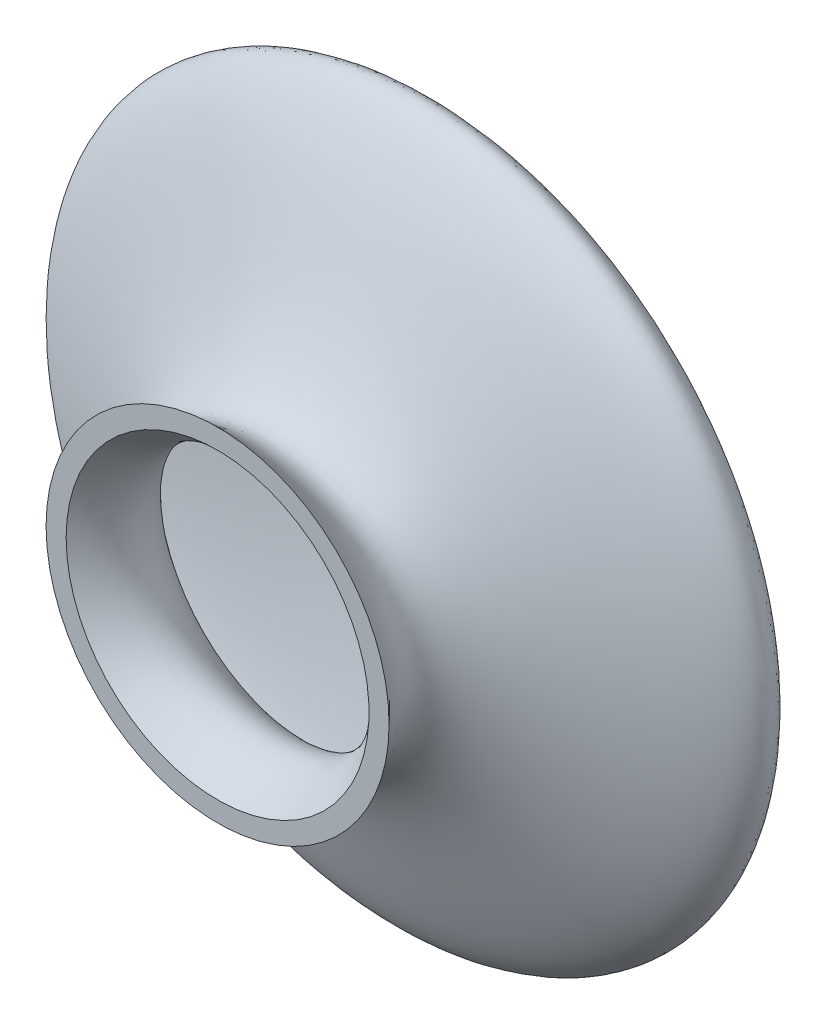
ISO-10303-21;
HEADER;
FILE_DESCRIPTION(('STEP AP214'),'2;1');
FILE_NAME('part.step','',(''),(''),'','','');
FILE_SCHEMA(('AUTOMOTIVE_DESIGN { 1 0 10303 214 1 1 1 1 }'));
ENDSEC;
DATA;
#1=APPLICATION_CONTEXT('core data for automotive mechanical design processes');
#2=APPLICATION_PROTOCOL_DEFINITION('international standard','automotive_design',2000,#1);
#3=PRODUCT_CONTEXT('',#1,'mechanical');
#4=PRODUCT('Part','Part','',(#3));
#5=PRODUCT_RELATED_PRODUCT_CATEGORY('part','',(#4));
#6=PRODUCT_DEFINITION_FORMATION('','',#4);
#7=PRODUCT_DEFINITION_CONTEXT('part definition',#1,'design');
#8=PRODUCT_DEFINITION('design','',#6,#7);
#9=PRODUCT_DEFINITION_SHAPE('','',#8);
#10=(LENGTH_UNIT() NAMED_UNIT(*) SI_UNIT(.MILLI.,.METRE.));
#11=(NAMED_UNIT(*) PLANE_ANGLE_UNIT() SI_UNIT($,.RADIAN.));
#12=(NAMED_UNIT(*) SI_UNIT($,.STERADIAN.) SOLID_ANGLE_UNIT());
#13=UNCERTAINTY_MEASURE_WITH_UNIT(LENGTH_MEASURE(1.E-05),#10,'distance_accuracy_value','');
#14=(GEOMETRIC_REPRESENTATION_CONTEXT(3) GLOBAL_UNCERTAINTY_ASSIGNED_CONTEXT((#13)) GLOBAL_UNIT_ASSIGNED_CONTEXT((#10,
#11,#12)) REPRESENTATION_CONTEXT('',''));
#15=CARTESIAN_POINT('',(0.,0.,0.));
#16=DIRECTION('',(0.,0.,1.));
#17=DIRECTION('',(1.,0.,0.));
#18=AXIS2_PLACEMENT_3D('',#15,#16,#17);
#19=CARTESIAN_POINT('',(0.,0.,-9.49240269782041E-12));
#20=DIRECTION('',(0.,0.,-1.));
#21=DIRECTION('',(-1.,0.,0.));
#22=AXIS2_PLACEMENT_3D('',#19,#20,#21);
#23=PLANE('',#22);
#24=CARTESIAN_POINT('',(0.,0.,-9.24434140348041E-12));
#25=DIRECTION('',(0.,0.,-1.));
#26=DIRECTION('',(-1.,0.,0.));
#27=AXIS2_PLACEMENT_3D('',#24,#25,#26);
#28=CIRCLE('',#27,67.2870696299396);
#29=CARTESIAN_POINT('',(-67.2870696299396,0.,-9.24434140348041E-12));
#30=VERTEX_POINT('',#29);
#31=EDGE_CURVE('E51',#30,#30,#28,.T.);
#32=ORIENTED_EDGE('',*,*,#31,.T.);
#33=EDGE_LOOP('',(#32));
#34=FACE_BOUND('',#33,.T.);
#35=CARTESIAN_POINT('',(0.,0.,-1.00197544717927E-11));
#36=DIRECTION('',(0.,0.,-1.));
#37=DIRECTION('',(-1.,0.,0.));
#38=AXIS2_PLACEMENT_3D('',#35,#36,#37);
#39=CIRCLE('',#38,76.199999999999);
#40=CARTESIAN_POINT('',(-76.199999999999,0.,-1.00197544717927E-11));
#41=VERTEX_POINT('',#40);
#42=EDGE_CURVE('E10',#41,#41,#39,.T.);
#43=ORIENTED_EDGE('',*,*,#42,.F.);
#44=EDGE_LOOP('',(#43));
#45=FACE_BOUND('',#44,.T.);
#46=ADVANCED_FACE('F41',(#34,#45),#23,.F.);
#47=CARTESIAN_POINT('',(0.,76.199999999999,-1.00197544717927E-11));
#48=CARTESIAN_POINT('',(0.,75.8714966061451,-0.328503393863798));
#49=CARTESIAN_POINT('',(0.,75.2127945752639,-0.987205163745643));
#50=CARTESIAN_POINT('',(0.,73.9555176767236,-2.24790580227543));
#51=CARTESIAN_POINT('',(0.,73.0366103829999,-3.1865669385281));
#52=CARTESIAN_POINT('',(0.,72.0110012925829,-4.24469825216351));
#53=CARTESIAN_POINT('',(0.,71.2976259778192,-4.9961633037676));
#54=CARTESIAN_POINT('',(0.,70.3691596107694,-5.99031210325277));
#55=CARTESIAN_POINT('',(0.,69.2870041602693,-7.18619020818664));
#56=CARTESIAN_POINT('',(0.,68.0521456286852,-8.6164862241662));
#57=CARTESIAN_POINT('',(0.,66.7066944853866,-10.3012394803021));
#58=CARTESIAN_POINT('',(0.,65.284877466277,-12.2729195042184));
#59=CARTESIAN_POINT('',(0.,63.8738490136507,-14.5796703504707));
#60=CARTESIAN_POINT('',(0.,62.733756377282,-17.0529742852569));
#61=CARTESIAN_POINT('',(0.,62.0321026581446,-19.7008965771975));
#62=CARTESIAN_POINT('',(0.,61.8420455426465,-22.5472044629869));
#63=CARTESIAN_POINT('',(0.,62.2683540014917,-25.1919309346875));
#64=CARTESIAN_POINT('',(0.,63.3007956089964,-27.7355175309453));
#65=CARTESIAN_POINT('',(0.,65.0655261637073,-30.522581942457));
#66=CARTESIAN_POINT('',(0.,67.3578001099873,-33.1569890766619));
#67=CARTESIAN_POINT('',(0.,70.3770141735285,-35.8605910837303));
#68=CARTESIAN_POINT('',(0.,74.0989240465665,-38.5916748553056));
#69=CARTESIAN_POINT('',(0.,78.0556741421943,-41.1032395134502));
#70=CARTESIAN_POINT('',(0.,82.1931006526982,-43.4557871641413));
#71=CARTESIAN_POINT('',(0.,86.5438572191808,-45.7294453750235));
#72=CARTESIAN_POINT('',(0.,91.0907221088303,-47.9486064904627));
#73=CARTESIAN_POINT('',(0.,95.8195856276551,-50.134576859331));
#74=CARTESIAN_POINT('',(0.,100.719657546433,-52.3071530651726));
#75=CARTESIAN_POINT('',(0.,105.642717798639,-54.4267763871684));
#76=CARTESIAN_POINT('',(0.,110.579691763938,-56.5137495341937));
#77=CARTESIAN_POINT('',(0.,115.522613021701,-58.586511127106));
#78=CARTESIAN_POINT('',(0.,120.463920296641,-60.6631458678321));
#79=CARTESIAN_POINT('',(0.,125.395633336819,-62.7625628695974));
#80=CARTESIAN_POINT('',(0.,130.308345918227,-64.9062199269017));
#81=CARTESIAN_POINT('',(0.,134.579832966638,-66.8433166566973));
#82=CARTESIAN_POINT('',(0.,138.21082710501,-68.5689560544405));
#83=CARTESIAN_POINT('',(0.,141.208211575862,-70.0653882629235));
#84=CARTESIAN_POINT('',(0.,143.584067109498,-71.305529806437));
#85=CARTESIAN_POINT('',(0.,146.516608758822,-72.9185589189232));
#86=CARTESIAN_POINT('',(0.,149.385685127137,-74.638955030427));
#87=CARTESIAN_POINT('',(0.,152.164282755896,-76.5037451188669));
#88=CARTESIAN_POINT('',(0.,154.695745628364,-78.5261501063263));
#89=CARTESIAN_POINT('',(0.,156.489785034097,-80.2218743037794));
#90=CARTESIAN_POINT('',(0.,158.07121196666,-82.1096843306828));
#91=CARTESIAN_POINT('',(0.,159.235004279573,-84.1002837991871));
#92=CARTESIAN_POINT('',(0.,159.868404088857,-86.375519825452));
#93=CARTESIAN_POINT('',(0.,159.66902640345,-88.6023520788085));
#94=CARTESIAN_POINT('',(0.,158.910364226834,-90.4377876293398));
#95=CARTESIAN_POINT('',(0.,157.819977875586,-92.0389326766161));
#96=CARTESIAN_POINT('',(0.,156.600828007564,-93.3778094643677));
#97=CARTESIAN_POINT('',(0.,154.873952166804,-94.9188838787479));
#98=CARTESIAN_POINT('',(0.,152.350443370057,-96.732184403701));
#99=CARTESIAN_POINT('',(0.,149.013277462962,-98.6722168502419));
#100=CARTESIAN_POINT('',(0.,144.86093606248,-100.679648830935));
#101=CARTESIAN_POINT('',(0.,140.345712209792,-102.567268971109));
#102=CARTESIAN_POINT('',(0.,135.503404605993,-104.375444691424));
#103=CARTESIAN_POINT('',(0.,130.348265416165,-106.120378490141));
#104=CARTESIAN_POINT('',(0.,124.887110457484,-107.817635085279));
#105=CARTESIAN_POINT('',(0.,119.130971603905,-109.478553407066));
#106=CARTESIAN_POINT('',(0.,111.89908549494,-111.438765264949));
#107=CARTESIAN_POINT('',(0.,103.187830356483,-113.63848984804));
#108=CARTESIAN_POINT('',(0.,92.9743398140953,-116.043725439247));
#109=CARTESIAN_POINT('',(0.,81.2804928517385,-118.631162779468));
#110=CARTESIAN_POINT('',(0.,69.549204590912,-121.107833030023));
#111=CARTESIAN_POINT('',(0.,59.2534656386495,-123.20819866891));
#112=CARTESIAN_POINT('',(0.,50.6007664397721,-124.940007359801));
#113=CARTESIAN_POINT('',(0.,44.046147002131,-126.236821279319));
#114=CARTESIAN_POINT('',(0.,41.4414019211042,-126.75060481357));
#115=CARTESIAN_POINT('',(0.,40.174902446169,-127.000000000009));
#116=B_SPLINE_CURVE_WITH_KNOTS('',4,(#47,#48,#49,#50,#51,#52,#53,#54,#55,#56,#57,#58,#59,#60,
#61,#62,#63,#64,#65,#66,#67,#68,#69,#70,#71,#72,#73,#74,#75,#76,#77,#78,#79,#80,#81,#82,#83,#84,
#85,#86,#87,#88,#89,#90,#91,#92,#93,#94,#95,#96,#97,#98,#99,#100,#101,#102,#103,#104,#105,#106,
#107,#108,#109,#110,#111,#112,#113,#114,#115),.UNSPECIFIED.,.F.,.F.,(5,1,1,1,1,1,1,1,1,1,1,1,1,
1,1,1,1,1,1,1,1,1,1,1,1,1,1,1,1,1,1,1,1,1,1,1,1,1,1,1,1,1,1,1,1,1,1,1,1,1,1,1,1,1,1,1,1,1,1,1,1,
1,1,1,1,5),(0.0525184971901413,0.0592085499286976,0.0658986026672538,0.069243629036532,
0.0725886554058101,0.0759336817750882,0.0792787081443663,0.0859687608829226,0.0926588136214788,
0.0993488663600351,0.106038919098591,0.116107164592465,0.126175410086339,0.132998817346758,
0.139822224607177,0.151318765510543,0.159054087952569,0.166789410394596,0.180637507131469,
0.194485603868343,0.209245271268088,0.224004938667834,0.238764606067579,0.253524273467325,
0.270151396365897,0.286778519264469,0.30340564216304,0.320032765061612,0.336659899608255,
0.353287034154897,0.36991416870154,0.386541303248183,0.403168460107387,0.419795616966592,
0.428109195396194,0.436422773825796,0.444736352255399,0.453049930685001,0.469632391548617,
0.477923621980424,0.486214852412232,0.493217173453563,0.500219494494894,0.508389593693414,
0.514638594424753,0.522007766719249,0.527385117299014,0.53276246787878,0.538589230258358,
0.544415992637936,0.556069517397092,0.57124705160388,0.586424585810669,0.601602120017458,
0.616779654224247,0.635368050715043,0.65395644720584,0.672544843696637,0.691133240187433,
0.728309822429128,0.765486404670824,0.802663090602128,0.839839776533432,0.877016465154418,
0.895604809464911,0.914193153775404),.UNSPECIFIED.);
#117=CARTESIAN_POINT('',(0.,0.,-8.96505092384814E-12));
#118=DIRECTION('',(0.,0.,-1.));
#119=AXIS1_PLACEMENT('',#117,#118);
#120=SURFACE_OF_REVOLUTION('',#116,#119);
#121=CARTESIAN_POINT('',(0.,0.,-127.000000000009));
#122=DIRECTION('',(0.,0.,-1.));
#123=DIRECTION('',(-1.,0.,0.));
#124=AXIS2_PLACEMENT_3D('',#121,#122,#123);
#125=CIRCLE('',#124,40.1749024461666);
#126=CARTESIAN_POINT('',(-40.1749024461666,0.,-127.000000000009));
#127=VERTEX_POINT('',#126);
#128=EDGE_CURVE('E47',#127,#127,#125,.T.);
#129=ORIENTED_EDGE('',*,*,#128,.F.);
#130=EDGE_LOOP('',(#129));
#131=FACE_BOUND('',#130,.T.);
#132=ORIENTED_EDGE('',*,*,#42,.T.);
#133=EDGE_LOOP('',(#132));
#134=FACE_BOUND('',#133,.T.);
#135=ADVANCED_FACE('F66',(#131,#134),#120,.T.);
#136=CARTESIAN_POINT('',(0.,0.,-127.000000000009));
#137=DIRECTION('',(0.,0.,-1.));
#138=DIRECTION('',(-1.,0.,0.));
#139=AXIS2_PLACEMENT_3D('',#136,#137,#138);
#140=PLANE('',#139);
#141=ORIENTED_EDGE('',*,*,#128,.T.);
#142=EDGE_LOOP('',(#141));
#143=FACE_BOUND('',#142,.T.);
#144=ADVANCED_FACE('F71',(#143),#140,.T.);
#145=CARTESIAN_POINT('',(0.,76.199999999999,-1.00197544717927E-11));
#146=CARTESIAN_POINT('',(0.,75.8714966061451,-0.328503393863798));
#147=CARTESIAN_POINT('',(0.,75.2127945752639,-0.987205163745643));
#148=CARTESIAN_POINT('',(0.,73.9555176767236,-2.24790580227543));
#149=CARTESIAN_POINT('',(0.,73.0366103829999,-3.1865669385281));
#150=CARTESIAN_POINT('',(0.,72.0110012925829,-4.24469825216351));
#151=CARTESIAN_POINT('',(0.,71.2976259778192,-4.9961633037676));
#152=CARTESIAN_POINT('',(0.,70.3691596107694,-5.99031210325277));
#153=CARTESIAN_POINT('',(0.,69.2870041602693,-7.18619020818664));
#154=CARTESIAN_POINT('',(0.,68.0521456286852,-8.6164862241662));
#155=CARTESIAN_POINT('',(0.,66.7066944853866,-10.3012394803021));
#156=CARTESIAN_POINT('',(0.,65.284877466277,-12.2729195042184));
#157=CARTESIAN_POINT('',(0.,63.8738490136507,-14.5796703504707));
#158=CARTESIAN_POINT('',(0.,62.733756377282,-17.0529742852569));
#159=CARTESIAN_POINT('',(0.,62.0321026581446,-19.7008965771975));
#160=CARTESIAN_POINT('',(0.,61.8420455426465,-22.5472044629869));
#161=CARTESIAN_POINT('',(0.,62.2683540014917,-25.1919309346875));
#162=CARTESIAN_POINT('',(0.,63.3007956089964,-27.7355175309453));
#163=CARTESIAN_POINT('',(0.,65.0655261637073,-30.522581942457));
#164=CARTESIAN_POINT('',(0.,67.3578001099873,-33.1569890766619));
#165=CARTESIAN_POINT('',(0.,70.3770141735285,-35.8605910837303));
#166=CARTESIAN_POINT('',(0.,74.0989240465665,-38.5916748553056));
#167=CARTESIAN_POINT('',(0.,78.0556741421943,-41.1032395134502));
#168=CARTESIAN_POINT('',(0.,82.1931006526982,-43.4557871641413));
#169=CARTESIAN_POINT('',(0.,86.5438572191808,-45.7294453750235));
#170=CARTESIAN_POINT('',(0.,91.0907221088303,-47.9486064904627));
#171=CARTESIAN_POINT('',(0.,95.8195856276551,-50.134576859331));
#172=CARTESIAN_POINT('',(0.,100.719657546433,-52.3071530651726));
#173=CARTESIAN_POINT('',(0.,105.642717798639,-54.4267763871684));
#174=CARTESIAN_POINT('',(0.,110.579691763938,-56.5137495341937));
#175=CARTESIAN_POINT('',(0.,115.522613021701,-58.586511127106));
#176=CARTESIAN_POINT('',(0.,120.463920296641,-60.6631458678321));
#177=CARTESIAN_POINT('',(0.,125.395633336819,-62.7625628695974));
#178=CARTESIAN_POINT('',(0.,130.308345918227,-64.9062199269017));
#179=CARTESIAN_POINT('',(0.,134.579832966638,-66.8433166566973));
#180=CARTESIAN_POINT('',(0.,138.21082710501,-68.5689560544405));
#181=CARTESIAN_POINT('',(0.,141.208211575862,-70.0653882629235));
#182=CARTESIAN_POINT('',(0.,143.584067109498,-71.305529806437));
#183=CARTESIAN_POINT('',(0.,146.516608758822,-72.9185589189232));
#184=CARTESIAN_POINT('',(0.,149.385685127137,-74.638955030427));
#185=CARTESIAN_POINT('',(0.,152.164282755896,-76.5037451188669));
#186=CARTESIAN_POINT('',(0.,154.695745628364,-78.5261501063263));
#187=CARTESIAN_POINT('',(0.,156.489785034097,-80.2218743037794));
#188=CARTESIAN_POINT('',(0.,158.07121196666,-82.1096843306828));
#189=CARTESIAN_POINT('',(0.,159.235004279573,-84.1002837991871));
#190=CARTESIAN_POINT('',(0.,159.868404088857,-86.375519825452));
#191=CARTESIAN_POINT('',(0.,159.66902640345,-88.6023520788085));
#192=CARTESIAN_POINT('',(0.,158.910364226834,-90.4377876293398));
#193=CARTESIAN_POINT('',(0.,157.819977875586,-92.0389326766161));
#194=CARTESIAN_POINT('',(0.,156.600828007564,-93.3778094643677));
#195=CARTESIAN_POINT('',(0.,154.873952166804,-94.9188838787479));
#196=CARTESIAN_POINT('',(0.,152.350443370057,-96.732184403701));
#197=CARTESIAN_POINT('',(0.,149.013277462962,-98.6722168502419));
#198=CARTESIAN_POINT('',(0.,144.86093606248,-100.679648830935));
#199=CARTESIAN_POINT('',(0.,140.345712209792,-102.567268971109));
#200=CARTESIAN_POINT('',(0.,135.503404605993,-104.375444691424));
#201=CARTESIAN_POINT('',(0.,130.348265416165,-106.120378490141));
#202=CARTESIAN_POINT('',(0.,124.887110457484,-107.817635085279));
#203=CARTESIAN_POINT('',(0.,119.130971603905,-109.478553407066));
#204=CARTESIAN_POINT('',(0.,111.89908549494,-111.438765264949));
#205=CARTESIAN_POINT('',(0.,103.187830356483,-113.63848984804));
#206=CARTESIAN_POINT('',(0.,92.9743398140953,-116.043725439247));
#207=CARTESIAN_POINT('',(0.,81.2804928517385,-118.631162779468));
#208=CARTESIAN_POINT('',(0.,69.549204590912,-121.107833030023));
#209=CARTESIAN_POINT('',(0.,59.2534656386495,-123.20819866891));
#210=CARTESIAN_POINT('',(0.,50.6007664397721,-124.940007359801));
#211=CARTESIAN_POINT('',(0.,44.046147002131,-126.236821279319));
#212=CARTESIAN_POINT('',(0.,41.4414019211042,-126.75060481357));
#213=CARTESIAN_POINT('',(0.,40.174902446169,-127.000000000009));
#214=B_SPLINE_CURVE_WITH_KNOTS('',4,(#145,#146,#147,#148,#149,#150,#151,#152,#153,#154,#155,
#156,#157,#158,#159,#160,#161,#162,#163,#164,#165,#166,#167,#168,#169,#170,#171,#172,#173,#174,
#175,#176,#177,#178,#179,#180,#181,#182,#183,#184,#185,#186,#187,#188,#189,#190,#191,#192,#193,
#194,#195,#196,#197,#198,#199,#200,#201,#202,#203,#204,#205,#206,#207,#208,#209,#210,#211,#212,
#213),.UNSPECIFIED.,.F.,.F.,(5,1,1,1,1,1,1,1,1,1,1,1,1,1,1,1,1,1,1,1,1,1,1,1,1,1,1,1,1,1,1,1,1,
1,1,1,1,1,1,1,1,1,1,1,1,1,1,1,1,1,1,1,1,1,1,1,1,1,1,1,1,1,1,1,1,5),(0.0525184971901413,
0.0592085499286976,0.0658986026672538,0.069243629036532,0.0725886554058101,0.0759336817750882,
0.0792787081443663,0.0859687608829226,0.0926588136214788,0.0993488663600351,0.106038919098591,
0.116107164592465,0.126175410086339,0.132998817346758,0.139822224607177,0.151318765510543,
0.159054087952569,0.166789410394596,0.180637507131469,0.194485603868343,0.209245271268088,
0.224004938667834,0.238764606067579,0.253524273467325,0.270151396365897,0.286778519264469,
0.30340564216304,0.320032765061612,0.336659899608255,0.353287034154897,0.36991416870154,
0.386541303248183,0.403168460107387,0.419795616966592,0.428109195396194,0.436422773825796,
0.444736352255399,0.453049930685001,0.469632391548617,0.477923621980424,0.486214852412232,
0.493217173453563,0.500219494494894,0.508389593693414,0.514638594424753,0.522007766719249,
0.527385117299014,0.53276246787878,0.538589230258358,0.544415992637936,0.556069517397092,
0.57124705160388,0.586424585810669,0.601602120017458,0.616779654224247,0.635368050715043,
0.65395644720584,0.672544843696637,0.691133240187433,0.728309822429128,0.765486404670824,
0.802663090602128,0.839839776533432,0.877016465154418,0.895604809464911,0.914193153775404),.UNSPECIFIED.);
#215=CARTESIAN_POINT('',(0.,0.,-8.96505092384814E-12));
#216=DIRECTION('',(0.,0.,-1.));
#217=AXIS1_PLACEMENT('',#215,#216);
#218=SURFACE_OF_REVOLUTION('',#214,#217);
#219=OFFSET_SURFACE('',#218,-6.35,.F.);
#220=CARTESIAN_POINT('',(0.,0.,-120.650000000009));
#221=DIRECTION('',(0.,0.,-1.));
#222=DIRECTION('',(-1.,0.,0.));
#223=AXIS2_PLACEMENT_3D('',#220,#221,#222);
#224=CIRCLE('',#223,39.5554461194058);
#225=CARTESIAN_POINT('',(-39.5554461194058,0.,-120.650000000009));
#226=VERTEX_POINT('',#225);
#227=EDGE_CURVE('E55',#226,#226,#224,.T.);
#228=ORIENTED_EDGE('',*,*,#227,.T.);
#229=EDGE_LOOP('',(#228));
#230=FACE_BOUND('',#229,.T.);
#231=ORIENTED_EDGE('',*,*,#31,.F.);
#232=EDGE_LOOP('',(#231));
#233=FACE_BOUND('',#232,.T.);
#234=ADVANCED_FACE('F73',(#230,#233),#219,.F.);
#235=CARTESIAN_POINT('',(0.,0.,-120.650000000009));
#236=DIRECTION('',(0.,0.,-1.));
#237=DIRECTION('',(-1.,0.,0.));
#238=AXIS2_PLACEMENT_3D('',#235,#236,#237);
#239=PLANE('',#238);
#240=ORIENTED_EDGE('',*,*,#227,.F.);
#241=EDGE_LOOP('',(#240));
#242=FACE_BOUND('',#241,.T.);
#243=ADVANCED_FACE('F74',(#242),#239,.F.);
#244=CLOSED_SHELL('',(#46,#135,#144,#234,#243));
#245=MANIFOLD_SOLID_BREP('B2',#244);
#246=ADVANCED_BREP_SHAPE_REPRESENTATION('',(#18,#245),#14);
#247=SHAPE_DEFINITION_REPRESENTATION(#9,#246);
ENDSEC;
END-ISO-10303-21;
